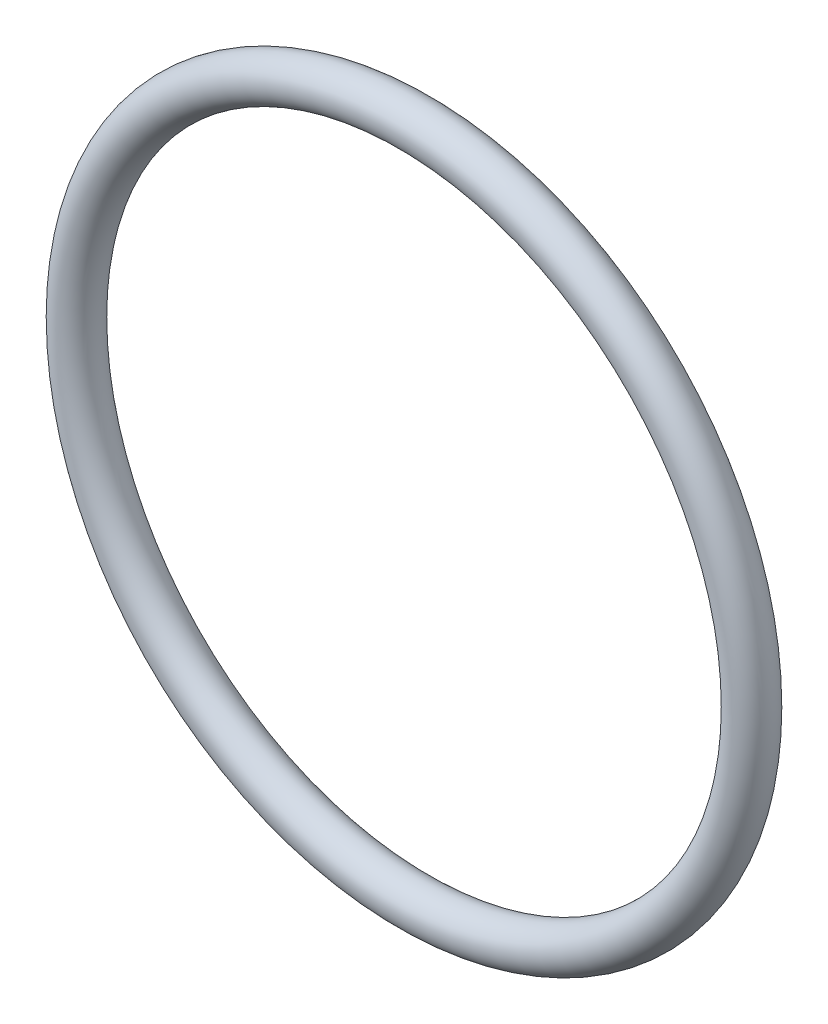
ISO-10303-21;
HEADER;
FILE_DESCRIPTION(('STEP AP214'),'2;1');
FILE_NAME('part.step','',(''),(''),'','','');
FILE_SCHEMA(('AUTOMOTIVE_DESIGN { 1 0 10303 214 1 1 1 1 }'));
ENDSEC;
DATA;
#1=APPLICATION_CONTEXT('core data for automotive mechanical design processes');
#2=APPLICATION_PROTOCOL_DEFINITION('international standard','automotive_design',2000,#1);
#3=PRODUCT_CONTEXT('',#1,'mechanical');
#4=PRODUCT('Part','Part','',(#3));
#5=PRODUCT_RELATED_PRODUCT_CATEGORY('part','',(#4));
#6=PRODUCT_DEFINITION_FORMATION('','',#4);
#7=PRODUCT_DEFINITION_CONTEXT('part definition',#1,'design');
#8=PRODUCT_DEFINITION('design','',#6,#7);
#9=PRODUCT_DEFINITION_SHAPE('','',#8);
#10=(LENGTH_UNIT() NAMED_UNIT(*) SI_UNIT(.MILLI.,.METRE.));
#11=(NAMED_UNIT(*) PLANE_ANGLE_UNIT() SI_UNIT($,.RADIAN.));
#12=(NAMED_UNIT(*) SI_UNIT($,.STERADIAN.) SOLID_ANGLE_UNIT());
#13=UNCERTAINTY_MEASURE_WITH_UNIT(LENGTH_MEASURE(1.E-05),#10,'distance_accuracy_value','');
#14=(GEOMETRIC_REPRESENTATION_CONTEXT(3) GLOBAL_UNCERTAINTY_ASSIGNED_CONTEXT((#13)) GLOBAL_UNIT_ASSIGNED_CONTEXT((#10,
#11,#12)) REPRESENTATION_CONTEXT('',''));
#15=CARTESIAN_POINT('',(0.,0.,0.));
#16=DIRECTION('',(0.,0.,1.));
#17=DIRECTION('',(1.,0.,0.));
#18=AXIS2_PLACEMENT_3D('',#15,#16,#17);
#19=CARTESIAN_POINT('',(0.,0.,0.));
#20=DIRECTION('',(0.,0.,1.));
#21=DIRECTION('',(1.,0.,0.));
#22=AXIS2_PLACEMENT_3D('',#19,#20,#21);
#23=TOROIDAL_SURFACE('',#22,42.037,2.667);
#24=CARTESIAN_POINT('',(44.704,0.,0.));
#25=VERTEX_POINT('',#24);
#26=VERTEX_LOOP('',#25);
#27=FACE_BOUND('',#26,.T.);
#28=ADVANCED_FACE('F33',(#27),#23,.T.);
#29=CLOSED_SHELL('',(#28));
#30=MANIFOLD_SOLID_BREP('B2',#29);
#31=ADVANCED_BREP_SHAPE_REPRESENTATION('',(#18,#30),#14);
#32=SHAPE_DEFINITION_REPRESENTATION(#9,#31);
ENDSEC;
END-ISO-10303-21;
